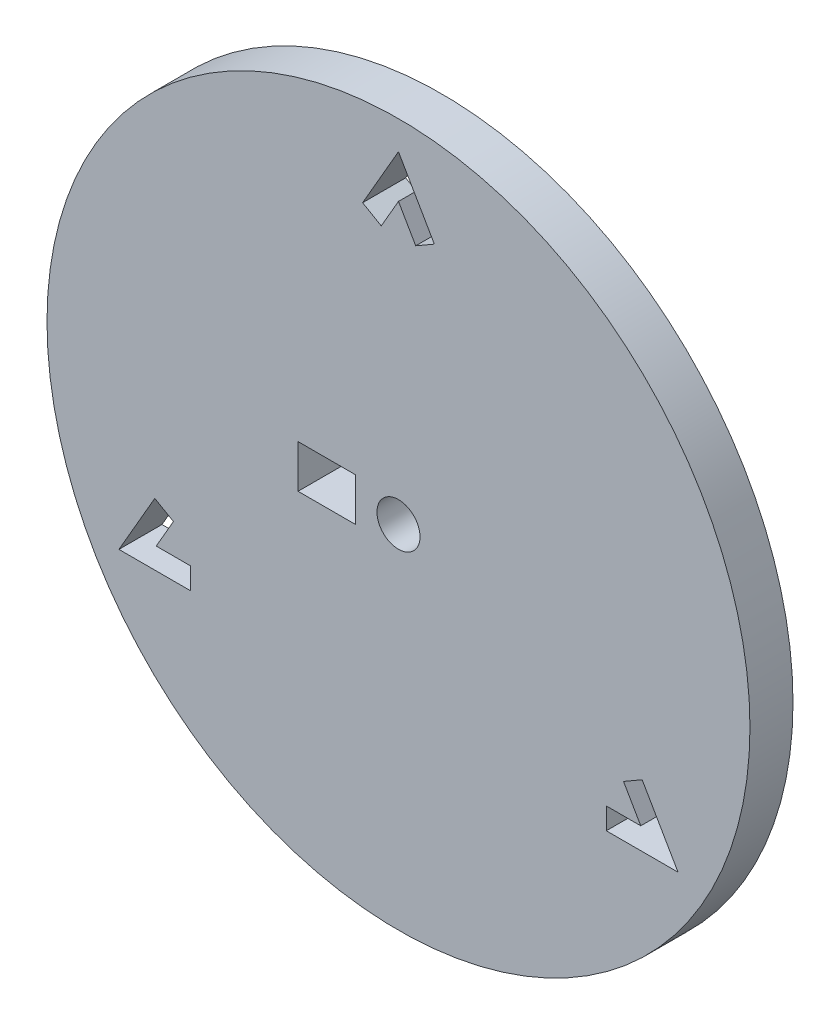
ISO-10303-21;
HEADER;
FILE_DESCRIPTION(('STEP AP214'),'2;1');
FILE_NAME('part.step','',(''),(''),'','','');
FILE_SCHEMA(('AUTOMOTIVE_DESIGN { 1 0 10303 214 1 1 1 1 }'));
ENDSEC;
DATA;
#1=APPLICATION_CONTEXT('core data for automotive mechanical design processes');
#2=APPLICATION_PROTOCOL_DEFINITION('international standard','automotive_design',2000,#1);
#3=PRODUCT_CONTEXT('',#1,'mechanical');
#4=PRODUCT('Part','Part','',(#3));
#5=PRODUCT_RELATED_PRODUCT_CATEGORY('part','',(#4));
#6=PRODUCT_DEFINITION_FORMATION('','',#4);
#7=PRODUCT_DEFINITION_CONTEXT('part definition',#1,'design');
#8=PRODUCT_DEFINITION('design','',#6,#7);
#9=PRODUCT_DEFINITION_SHAPE('','',#8);
#10=(LENGTH_UNIT() NAMED_UNIT(*) SI_UNIT(.MILLI.,.METRE.));
#11=(NAMED_UNIT(*) PLANE_ANGLE_UNIT() SI_UNIT($,.RADIAN.));
#12=(NAMED_UNIT(*) SI_UNIT($,.STERADIAN.) SOLID_ANGLE_UNIT());
#13=UNCERTAINTY_MEASURE_WITH_UNIT(LENGTH_MEASURE(1.E-05),#10,'distance_accuracy_value','');
#14=(GEOMETRIC_REPRESENTATION_CONTEXT(3) GLOBAL_UNCERTAINTY_ASSIGNED_CONTEXT((#13)) GLOBAL_UNIT_ASSIGNED_CONTEXT((#10,
#11,#12)) REPRESENTATION_CONTEXT('',''));
#15=CARTESIAN_POINT('',(0.,0.,0.));
#16=DIRECTION('',(0.,0.,1.));
#17=DIRECTION('',(1.,0.,0.));
#18=AXIS2_PLACEMENT_3D('',#15,#16,#17);
#19=CARTESIAN_POINT('',(-28.9711431702998,0.,6.));
#20=DIRECTION('',(-1.,0.,0.));
#21=DIRECTION('',(0.,0.,1.));
#22=AXIS2_PLACEMENT_3D('',#19,#20,#21);
#23=PLANE('',#22);
#24=DIRECTION('',(0.,1.,0.));
#25=VECTOR('',#24,1.);
#26=CARTESIAN_POINT('',(-28.9711431702998,0.,0.));
#27=LINE('',#26,#25);
#28=CARTESIAN_POINT('',(-28.9711431702998,-22.5,0.));
#29=VERTEX_POINT('',#28);
#30=CARTESIAN_POINT('',(-28.9711431702998,-19.5,0.));
#31=VERTEX_POINT('',#30);
#32=EDGE_CURVE('E300',#29,#31,#27,.T.);
#33=ORIENTED_EDGE('',*,*,#32,.F.);
#34=DIRECTION('',(0.,0.,-1.));
#35=VECTOR('',#34,1.);
#36=CARTESIAN_POINT('',(-28.9711431702998,-22.5,6.));
#37=LINE('',#36,#35);
#38=CARTESIAN_POINT('',(-28.9711431702998,-22.5,6.));
#39=VERTEX_POINT('',#38);
#40=EDGE_CURVE('E326',#39,#29,#37,.T.);
#41=ORIENTED_EDGE('',*,*,#40,.F.);
#42=DIRECTION('',(0.,1.,0.));
#43=VECTOR('',#42,1.);
#44=CARTESIAN_POINT('',(-28.9711431702998,0.,6.));
#45=LINE('',#44,#43);
#46=CARTESIAN_POINT('',(-28.9711431702998,-19.5,6.));
#47=VERTEX_POINT('',#46);
#48=EDGE_CURVE('E250',#39,#47,#45,.T.);
#49=ORIENTED_EDGE('',*,*,#48,.T.);
#50=DIRECTION('',(0.,0.,-1.));
#51=VECTOR('',#50,1.);
#52=CARTESIAN_POINT('',(-28.9711431702998,-19.5,6.));
#53=LINE('',#52,#51);
#54=EDGE_CURVE('E314',#47,#31,#53,.T.);
#55=ORIENTED_EDGE('',*,*,#54,.T.);
#56=EDGE_LOOP('',(#33,#41,#49,#55));
#57=FACE_BOUND('',#56,.T.);
#58=ADVANCED_FACE('F35',(#57),#23,.T.);
#59=CARTESIAN_POINT('',(0.,-22.5,6.));
#60=DIRECTION('',(0.,1.,0.));
#61=DIRECTION('',(-1.,0.,0.));
#62=AXIS2_PLACEMENT_3D('',#59,#60,#61);
#63=PLANE('',#62);
#64=DIRECTION('',(1.,0.,0.));
#65=VECTOR('',#64,1.);
#66=CARTESIAN_POINT('',(0.,-22.5,0.));
#67=LINE('',#66,#65);
#68=CARTESIAN_POINT('',(-38.9711431702998,-22.5,0.));
#69=VERTEX_POINT('',#68);
#70=EDGE_CURVE('E288',#69,#29,#67,.T.);
#71=ORIENTED_EDGE('',*,*,#70,.F.);
#72=DIRECTION('',(0.,0.,-1.));
#73=VECTOR('',#72,1.);
#74=CARTESIAN_POINT('',(-38.9711431702998,-22.5,6.));
#75=LINE('',#74,#73);
#76=CARTESIAN_POINT('',(-38.9711431702998,-22.5,6.));
#77=VERTEX_POINT('',#76);
#78=EDGE_CURVE('E324',#77,#69,#75,.T.);
#79=ORIENTED_EDGE('',*,*,#78,.F.);
#80=DIRECTION('',(1.,0.,0.));
#81=VECTOR('',#80,1.);
#82=CARTESIAN_POINT('',(0.,-22.5,6.));
#83=LINE('',#82,#81);
#84=EDGE_CURVE('E239',#77,#39,#83,.T.);
#85=ORIENTED_EDGE('',*,*,#84,.T.);
#86=ORIENTED_EDGE('',*,*,#40,.T.);
#87=EDGE_LOOP('',(#71,#79,#85,#86));
#88=FACE_BOUND('',#87,.T.);
#89=ADVANCED_FACE('F376',(#88),#63,.T.);
#90=CARTESIAN_POINT('',(-19.4855715851499,11.25,6.));
#91=DIRECTION('',(0.866025403784439,-0.5,0.));
#92=DIRECTION('',(0.5,0.866025403784439,0.));
#93=AXIS2_PLACEMENT_3D('',#90,#91,#92);
#94=PLANE('',#93);
#95=DIRECTION('',(-0.5,-0.866025403784439,0.));
#96=VECTOR('',#95,1.);
#97=CARTESIAN_POINT('',(-19.4855715851499,11.25,0.));
#98=LINE('',#97,#96);
#99=CARTESIAN_POINT('',(-33.9711431702998,-13.8397459621556,0.));
#100=VERTEX_POINT('',#99);
#101=EDGE_CURVE('E284',#100,#69,#98,.T.);
#102=ORIENTED_EDGE('',*,*,#101,.F.);
#103=DIRECTION('',(0.,0.,-1.));
#104=VECTOR('',#103,1.);
#105=CARTESIAN_POINT('',(-33.9711431702998,-13.8397459621556,6.));
#106=LINE('',#105,#104);
#107=CARTESIAN_POINT('',(-33.9711431702998,-13.8397459621556,6.));
#108=VERTEX_POINT('',#107);
#109=EDGE_CURVE('E322',#108,#100,#106,.T.);
#110=ORIENTED_EDGE('',*,*,#109,.F.);
#111=DIRECTION('',(-0.5,-0.866025403784439,0.));
#112=VECTOR('',#111,1.);
#113=CARTESIAN_POINT('',(-19.4855715851499,11.25,6.));
#114=LINE('',#113,#112);
#115=EDGE_CURVE('E235',#108,#77,#114,.T.);
#116=ORIENTED_EDGE('',*,*,#115,.T.);
#117=ORIENTED_EDGE('',*,*,#78,.T.);
#118=EDGE_LOOP('',(#102,#110,#116,#117));
#119=FACE_BOUND('',#118,.T.);
#120=ADVANCED_FACE('F382',(#119),#94,.T.);
#121=CARTESIAN_POINT('',(-14.4855715851499,-25.0897459621556,6.));
#122=DIRECTION('',(0.500000000000001,0.866025403784438,0.));
#123=DIRECTION('',(-0.866025403784438,0.500000000000001,0.));
#124=AXIS2_PLACEMENT_3D('',#121,#122,#123);
#125=PLANE('',#124);
#126=DIRECTION('',(0.866025403784438,-0.500000000000001,0.));
#127=VECTOR('',#126,1.);
#128=CARTESIAN_POINT('',(-14.4855715851499,-25.0897459621556,0.));
#129=LINE('',#128,#127);
#130=CARTESIAN_POINT('',(-31.3730669589464,-15.3397459621556,0.));
#131=VERTEX_POINT('',#130);
#132=EDGE_CURVE('E303',#100,#131,#129,.T.);
#133=ORIENTED_EDGE('',*,*,#132,.T.);
#134=DIRECTION('',(0.,0.,-1.));
#135=VECTOR('',#134,1.);
#136=CARTESIAN_POINT('',(-31.3730669589464,-15.3397459621556,6.));
#137=LINE('',#136,#135);
#138=CARTESIAN_POINT('',(-31.3730669589464,-15.3397459621556,6.));
#139=VERTEX_POINT('',#138);
#140=EDGE_CURVE('E319',#139,#131,#137,.T.);
#141=ORIENTED_EDGE('',*,*,#140,.F.);
#142=DIRECTION('',(0.866025403784438,-0.500000000000001,0.));
#143=VECTOR('',#142,1.);
#144=CARTESIAN_POINT('',(-14.4855715851499,-25.0897459621556,6.));
#145=LINE('',#144,#143);
#146=EDGE_CURVE('E253',#108,#139,#145,.T.);
#147=ORIENTED_EDGE('',*,*,#146,.F.);
#148=ORIENTED_EDGE('',*,*,#109,.T.);
#149=EDGE_LOOP('',(#133,#141,#147,#148));
#150=FACE_BOUND('',#149,.T.);
#151=ADVANCED_FACE('F568',(#150),#125,.F.);
#152=CARTESIAN_POINT('',(-16.8874953737965,9.75,6.));
#153=DIRECTION('',(0.866025403784439,-0.5,0.));
#154=DIRECTION('',(0.5,0.866025403784439,0.));
#155=AXIS2_PLACEMENT_3D('',#152,#153,#154);
#156=PLANE('',#155);
#157=DIRECTION('',(-0.5,-0.866025403784439,0.));
#158=VECTOR('',#157,1.);
#159=CARTESIAN_POINT('',(-16.8874953737965,9.75,0.));
#160=LINE('',#159,#158);
#161=CARTESIAN_POINT('',(-33.7749907475931,-19.5,0.));
#162=VERTEX_POINT('',#161);
#163=EDGE_CURVE('E306',#131,#162,#160,.T.);
#164=ORIENTED_EDGE('',*,*,#163,.T.);
#165=DIRECTION('',(0.,0.,-1.));
#166=VECTOR('',#165,1.);
#167=CARTESIAN_POINT('',(-33.7749907475931,-19.5,6.));
#168=LINE('',#167,#166);
#169=CARTESIAN_POINT('',(-33.7749907475931,-19.5,6.));
#170=VERTEX_POINT('',#169);
#171=EDGE_CURVE('E316',#170,#162,#168,.T.);
#172=ORIENTED_EDGE('',*,*,#171,.F.);
#173=DIRECTION('',(-0.5,-0.866025403784439,0.));
#174=VECTOR('',#173,1.);
#175=CARTESIAN_POINT('',(-16.8874953737965,9.75,6.));
#176=LINE('',#175,#174);
#177=EDGE_CURVE('E256',#139,#170,#176,.T.);
#178=ORIENTED_EDGE('',*,*,#177,.F.);
#179=ORIENTED_EDGE('',*,*,#140,.T.);
#180=EDGE_LOOP('',(#164,#172,#178,#179));
#181=FACE_BOUND('',#180,.T.);
#182=ADVANCED_FACE('F565',(#181),#156,.F.);
#183=CARTESIAN_POINT('',(28.9711431702997,-22.5,0.));
#184=VERTEX_POINT('',#183);
#185=CARTESIAN_POINT('',(38.9711431702997,-22.5,0.));
#186=VERTEX_POINT('',#185);
#187=EDGE_CURVE('E283',#184,#186,#67,.T.);
#188=ORIENTED_EDGE('',*,*,#187,.F.);
#189=DIRECTION('',(0.,0.,-1.));
#190=VECTOR('',#189,1.);
#191=CARTESIAN_POINT('',(28.9711431702997,-22.5,6.));
#192=LINE('',#191,#190);
#193=CARTESIAN_POINT('',(28.9711431702997,-22.5,6.));
#194=VERTEX_POINT('',#193);
#195=EDGE_CURVE('E317',#194,#184,#192,.T.);
#196=ORIENTED_EDGE('',*,*,#195,.F.);
#197=CARTESIAN_POINT('',(38.9711431702997,-22.5,6.));
#198=VERTEX_POINT('',#197);
#199=EDGE_CURVE('E234',#194,#198,#83,.T.);
#200=ORIENTED_EDGE('',*,*,#199,.T.);
#201=DIRECTION('',(0.,0.,-1.));
#202=VECTOR('',#201,1.);
#203=CARTESIAN_POINT('',(38.9711431702997,-22.5,6.));
#204=LINE('',#203,#202);
#205=EDGE_CURVE('E329',#198,#186,#204,.T.);
#206=ORIENTED_EDGE('',*,*,#205,.T.);
#207=EDGE_LOOP('',(#188,#196,#200,#206));
#208=FACE_BOUND('',#207,.T.);
#209=ADVANCED_FACE('F385',(#208),#63,.T.);
#210=CARTESIAN_POINT('',(28.9711431702997,0.,6.));
#211=DIRECTION('',(-1.,0.,0.));
#212=DIRECTION('',(0.,0.,1.));
#213=AXIS2_PLACEMENT_3D('',#210,#211,#212);
#214=PLANE('',#213);
#215=DIRECTION('',(0.,1.,0.));
#216=VECTOR('',#215,1.);
#217=CARTESIAN_POINT('',(28.9711431702997,0.,0.));
#218=LINE('',#217,#216);
#219=CARTESIAN_POINT('',(28.9711431702997,-19.5,0.));
#220=VERTEX_POINT('',#219);
#221=EDGE_CURVE('E287',#184,#220,#218,.T.);
#222=ORIENTED_EDGE('',*,*,#221,.T.);
#223=DIRECTION('',(0.,0.,-1.));
#224=VECTOR('',#223,1.);
#225=CARTESIAN_POINT('',(28.9711431702997,-19.5,6.));
#226=LINE('',#225,#224);
#227=CARTESIAN_POINT('',(28.9711431702997,-19.5,6.));
#228=VERTEX_POINT('',#227);
#229=EDGE_CURVE('E338',#228,#220,#226,.T.);
#230=ORIENTED_EDGE('',*,*,#229,.F.);
#231=DIRECTION('',(0.,1.,0.));
#232=VECTOR('',#231,1.);
#233=CARTESIAN_POINT('',(28.9711431702997,0.,6.));
#234=LINE('',#233,#232);
#235=EDGE_CURVE('E238',#194,#228,#234,.T.);
#236=ORIENTED_EDGE('',*,*,#235,.F.);
#237=ORIENTED_EDGE('',*,*,#195,.T.);
#238=EDGE_LOOP('',(#222,#230,#236,#237));
#239=FACE_BOUND('',#238,.T.);
#240=ADVANCED_FACE('F407',(#239),#214,.F.);
#241=CARTESIAN_POINT('',(0.,-19.5,6.));
#242=DIRECTION('',(0.,1.,0.));
#243=DIRECTION('',(0.,0.,1.));
#244=AXIS2_PLACEMENT_3D('',#241,#242,#243);
#245=PLANE('',#244);
#246=DIRECTION('',(1.,0.,0.));
#247=VECTOR('',#246,1.);
#248=CARTESIAN_POINT('',(0.,-19.5,0.));
#249=LINE('',#248,#247);
#250=CARTESIAN_POINT('',(33.7749907475931,-19.5,0.));
#251=VERTEX_POINT('',#250);
#252=EDGE_CURVE('E291',#220,#251,#249,.T.);
#253=ORIENTED_EDGE('',*,*,#252,.T.);
#254=DIRECTION('',(0.,0.,-1.));
#255=VECTOR('',#254,1.);
#256=CARTESIAN_POINT('',(33.7749907475931,-19.5,6.));
#257=LINE('',#256,#255);
#258=CARTESIAN_POINT('',(33.7749907475931,-19.5,6.));
#259=VERTEX_POINT('',#258);
#260=EDGE_CURVE('E336',#259,#251,#257,.T.);
#261=ORIENTED_EDGE('',*,*,#260,.F.);
#262=DIRECTION('',(1.,0.,0.));
#263=VECTOR('',#262,1.);
#264=CARTESIAN_POINT('',(0.,-19.5,6.));
#265=LINE('',#264,#263);
#266=EDGE_CURVE('E242',#228,#259,#265,.T.);
#267=ORIENTED_EDGE('',*,*,#266,.F.);
#268=ORIENTED_EDGE('',*,*,#229,.T.);
#269=EDGE_LOOP('',(#253,#261,#267,#268));
#270=FACE_BOUND('',#269,.T.);
#271=ADVANCED_FACE('F403',(#270),#245,.F.);
#272=CARTESIAN_POINT('',(16.8874953737965,9.75,6.));
#273=DIRECTION('',(0.866025403784439,0.5,0.));
#274=DIRECTION('',(-0.5,0.866025403784439,0.));
#275=AXIS2_PLACEMENT_3D('',#272,#273,#274);
#276=PLANE('',#275);
#277=DIRECTION('',(0.5,-0.866025403784439,0.));
#278=VECTOR('',#277,1.);
#279=CARTESIAN_POINT('',(16.8874953737965,9.75,0.));
#280=LINE('',#279,#278);
#281=CARTESIAN_POINT('',(31.3730669589464,-15.3397459621556,0.));
#282=VERTEX_POINT('',#281);
#283=EDGE_CURVE('E294',#282,#251,#280,.T.);
#284=ORIENTED_EDGE('',*,*,#283,.F.);
#285=DIRECTION('',(0.,0.,-1.));
#286=VECTOR('',#285,1.);
#287=CARTESIAN_POINT('',(31.3730669589464,-15.3397459621556,6.));
#288=LINE('',#287,#286);
#289=CARTESIAN_POINT('',(31.3730669589464,-15.3397459621556,6.));
#290=VERTEX_POINT('',#289);
#291=EDGE_CURVE('E334',#290,#282,#288,.T.);
#292=ORIENTED_EDGE('',*,*,#291,.F.);
#293=DIRECTION('',(0.5,-0.866025403784439,0.));
#294=VECTOR('',#293,1.);
#295=CARTESIAN_POINT('',(16.8874953737965,9.75,6.));
#296=LINE('',#295,#294);
#297=EDGE_CURVE('E244',#290,#259,#296,.T.);
#298=ORIENTED_EDGE('',*,*,#297,.T.);
#299=ORIENTED_EDGE('',*,*,#260,.T.);
#300=EDGE_LOOP('',(#284,#292,#298,#299));
#301=FACE_BOUND('',#300,.T.);
#302=ADVANCED_FACE('F399',(#301),#276,.T.);
#303=CARTESIAN_POINT('',(14.4855715851499,-25.0897459621556,6.));
#304=DIRECTION('',(0.5,-0.866025403784438,0.));
#305=DIRECTION('',(0.866025403784439,0.5,0.));
#306=AXIS2_PLACEMENT_3D('',#303,#304,#305);
#307=PLANE('',#306);
#308=DIRECTION('',(-0.866025403784439,-0.5,0.));
#309=VECTOR('',#308,1.);
#310=CARTESIAN_POINT('',(14.4855715851499,-25.0897459621556,0.));
#311=LINE('',#310,#309);
#312=CARTESIAN_POINT('',(33.9711431702997,-13.8397459621556,0.));
#313=VERTEX_POINT('',#312);
#314=EDGE_CURVE('E297',#313,#282,#311,.T.);
#315=ORIENTED_EDGE('',*,*,#314,.F.);
#316=DIRECTION('',(0.,0.,-1.));
#317=VECTOR('',#316,1.);
#318=CARTESIAN_POINT('',(33.9711431702997,-13.8397459621556,6.));
#319=LINE('',#318,#317);
#320=CARTESIAN_POINT('',(33.9711431702997,-13.8397459621556,6.));
#321=VERTEX_POINT('',#320);
#322=EDGE_CURVE('E331',#321,#313,#319,.T.);
#323=ORIENTED_EDGE('',*,*,#322,.F.);
#324=DIRECTION('',(-0.866025403784439,-0.5,0.));
#325=VECTOR('',#324,1.);
#326=CARTESIAN_POINT('',(14.4855715851499,-25.0897459621556,6.));
#327=LINE('',#326,#325);
#328=EDGE_CURVE('E247',#321,#290,#327,.T.);
#329=ORIENTED_EDGE('',*,*,#328,.T.);
#330=ORIENTED_EDGE('',*,*,#291,.T.);
#331=EDGE_LOOP('',(#315,#323,#329,#330));
#332=FACE_BOUND('',#331,.T.);
#333=ADVANCED_FACE('F396',(#332),#307,.T.);
#334=CARTESIAN_POINT('',(19.4855715851499,11.25,6.));
#335=DIRECTION('',(-0.866025403784439,-0.5,0.));
#336=DIRECTION('',(0.5,-0.866025403784439,0.));
#337=AXIS2_PLACEMENT_3D('',#334,#335,#336);
#338=PLANE('',#337);
#339=DIRECTION('',(-0.5,0.866025403784439,0.));
#340=VECTOR('',#339,1.);
#341=CARTESIAN_POINT('',(19.4855715851499,11.25,0.));
#342=LINE('',#341,#340);
#343=CARTESIAN_POINT('',(4.99999999999997,36.3397459621557,0.));
#344=VERTEX_POINT('',#343);
#345=CARTESIAN_POINT('',(0.,45.,0.));
#346=VERTEX_POINT('',#345);
#347=EDGE_CURVE('E265',#344,#346,#342,.T.);
#348=ORIENTED_EDGE('',*,*,#347,.F.);
#349=DIRECTION('',(0.,0.,-1.));
#350=VECTOR('',#349,1.);
#351=CARTESIAN_POINT('',(4.99999999999997,36.3397459621557,6.));
#352=LINE('',#351,#350);
#353=CARTESIAN_POINT('',(4.99999999999997,36.3397459621557,6.));
#354=VERTEX_POINT('',#353);
#355=EDGE_CURVE('E332',#354,#344,#352,.T.);
#356=ORIENTED_EDGE('',*,*,#355,.F.);
#357=DIRECTION('',(-0.5,0.866025403784439,0.));
#358=VECTOR('',#357,1.);
#359=CARTESIAN_POINT('',(19.4855715851499,11.25,6.));
#360=LINE('',#359,#358);
#361=CARTESIAN_POINT('',(0.,45.,6.));
#362=VERTEX_POINT('',#361);
#363=EDGE_CURVE('E216',#354,#362,#360,.T.);
#364=ORIENTED_EDGE('',*,*,#363,.T.);
#365=DIRECTION('',(0.,0.,-1.));
#366=VECTOR('',#365,1.);
#367=CARTESIAN_POINT('',(0.,45.,6.));
#368=LINE('',#367,#366);
#369=EDGE_CURVE('E264',#362,#346,#368,.T.);
#370=ORIENTED_EDGE('',*,*,#369,.T.);
#371=EDGE_LOOP('',(#348,#356,#364,#370));
#372=FACE_BOUND('',#371,.T.);
#373=ADVANCED_FACE('F395',(#372),#338,.T.);
#374=CARTESIAN_POINT('',(-14.4855715851499,25.0897459621557,6.));
#375=DIRECTION('',(0.499999999999999,-0.866025403784439,0.));
#376=DIRECTION('',(0.866025403784439,0.499999999999999,0.));
#377=AXIS2_PLACEMENT_3D('',#374,#375,#376);
#378=PLANE('',#377);
#379=DIRECTION('',(-0.866025403784439,-0.499999999999999,0.));
#380=VECTOR('',#379,1.);
#381=CARTESIAN_POINT('',(-14.4855715851499,25.0897459621557,0.));
#382=LINE('',#381,#380);
#383=CARTESIAN_POINT('',(2.40192378864667,34.8397459621556,0.));
#384=VERTEX_POINT('',#383);
#385=EDGE_CURVE('E268',#344,#384,#382,.T.);
#386=ORIENTED_EDGE('',*,*,#385,.T.);
#387=DIRECTION('',(0.,0.,-1.));
#388=VECTOR('',#387,1.);
#389=CARTESIAN_POINT('',(2.40192378864667,34.8397459621556,6.));
#390=LINE('',#389,#388);
#391=CARTESIAN_POINT('',(2.40192378864667,34.8397459621556,6.));
#392=VERTEX_POINT('',#391);
#393=EDGE_CURVE('E349',#392,#384,#390,.T.);
#394=ORIENTED_EDGE('',*,*,#393,.F.);
#395=DIRECTION('',(-0.866025403784439,-0.499999999999999,0.));
#396=VECTOR('',#395,1.);
#397=CARTESIAN_POINT('',(-14.4855715851499,25.0897459621557,6.));
#398=LINE('',#397,#396);
#399=EDGE_CURVE('E219',#354,#392,#398,.T.);
#400=ORIENTED_EDGE('',*,*,#399,.F.);
#401=ORIENTED_EDGE('',*,*,#355,.T.);
#402=EDGE_LOOP('',(#386,#394,#400,#401));
#403=FACE_BOUND('',#402,.T.);
#404=ADVANCED_FACE('F37',(#403),#378,.F.);
#405=CARTESIAN_POINT('',(16.8874953737965,9.74999999999996,6.));
#406=DIRECTION('',(-0.866025403784439,-0.499999999999999,0.));
#407=DIRECTION('',(0.499999999999999,-0.866025403784439,0.));
#408=AXIS2_PLACEMENT_3D('',#405,#406,#407);
#409=PLANE('',#408);
#410=DIRECTION('',(-0.499999999999999,0.866025403784439,0.));
#411=VECTOR('',#410,1.);
#412=CARTESIAN_POINT('',(16.8874953737965,9.74999999999996,0.));
#413=LINE('',#412,#411);
#414=CARTESIAN_POINT('',(0.,39.,0.));
#415=VERTEX_POINT('',#414);
#416=EDGE_CURVE('E271',#384,#415,#413,.T.);
#417=ORIENTED_EDGE('',*,*,#416,.T.);
#418=DIRECTION('',(0.,0.,-1.));
#419=VECTOR('',#418,1.);
#420=CARTESIAN_POINT('',(0.,39.,6.));
#421=LINE('',#420,#419);
#422=CARTESIAN_POINT('',(0.,39.,6.));
#423=VERTEX_POINT('',#422);
#424=EDGE_CURVE('E347',#423,#415,#421,.T.);
#425=ORIENTED_EDGE('',*,*,#424,.F.);
#426=DIRECTION('',(-0.499999999999999,0.866025403784439,0.));
#427=VECTOR('',#426,1.);
#428=CARTESIAN_POINT('',(16.8874953737965,9.74999999999996,6.));
#429=LINE('',#428,#427);
#430=EDGE_CURVE('E223',#392,#423,#429,.T.);
#431=ORIENTED_EDGE('',*,*,#430,.F.);
#432=ORIENTED_EDGE('',*,*,#393,.T.);
#433=EDGE_LOOP('',(#417,#425,#431,#432));
#434=FACE_BOUND('',#433,.T.);
#435=ADVANCED_FACE('F418',(#434),#409,.F.);
#436=CARTESIAN_POINT('',(-16.8874953737966,9.75000000000004,6.));
#437=DIRECTION('',(-0.866025403784438,0.500000000000001,0.));
#438=DIRECTION('',(-0.500000000000001,-0.866025403784438,0.));
#439=AXIS2_PLACEMENT_3D('',#436,#437,#438);
#440=PLANE('',#439);
#441=DIRECTION('',(0.500000000000001,0.866025403784438,0.));
#442=VECTOR('',#441,1.);
#443=CARTESIAN_POINT('',(-16.8874953737966,9.75000000000004,0.));
#444=LINE('',#443,#442);
#445=CARTESIAN_POINT('',(-2.40192378864669,34.8397459621556,0.));
#446=VERTEX_POINT('',#445);
#447=EDGE_CURVE('E274',#446,#415,#444,.T.);
#448=ORIENTED_EDGE('',*,*,#447,.F.);
#449=DIRECTION('',(0.,0.,-1.));
#450=VECTOR('',#449,1.);
#451=CARTESIAN_POINT('',(-2.40192378864669,34.8397459621556,6.));
#452=LINE('',#451,#450);
#453=CARTESIAN_POINT('',(-2.40192378864669,34.8397459621556,6.));
#454=VERTEX_POINT('',#453);
#455=EDGE_CURVE('E345',#454,#446,#452,.T.);
#456=ORIENTED_EDGE('',*,*,#455,.F.);
#457=DIRECTION('',(0.500000000000001,0.866025403784438,0.));
#458=VECTOR('',#457,1.);
#459=CARTESIAN_POINT('',(-16.8874953737966,9.75000000000004,6.));
#460=LINE('',#459,#458);
#461=EDGE_CURVE('E225',#454,#423,#460,.T.);
#462=ORIENTED_EDGE('',*,*,#461,.T.);
#463=ORIENTED_EDGE('',*,*,#424,.T.);
#464=EDGE_LOOP('',(#448,#456,#462,#463));
#465=FACE_BOUND('',#464,.T.);
#466=ADVANCED_FACE('F415',(#465),#440,.T.);
#467=CARTESIAN_POINT('',(14.4855715851499,25.0897459621556,6.));
#468=DIRECTION('',(0.5,0.866025403784439,0.));
#469=DIRECTION('',(-0.866025403784439,0.5,0.));
#470=AXIS2_PLACEMENT_3D('',#467,#468,#469);
#471=PLANE('',#470);
#472=DIRECTION('',(0.866025403784439,-0.5,0.));
#473=VECTOR('',#472,1.);
#474=CARTESIAN_POINT('',(14.4855715851499,25.0897459621556,0.));
#475=LINE('',#474,#473);
#476=CARTESIAN_POINT('',(-5.,36.3397459621556,0.));
#477=VERTEX_POINT('',#476);
#478=EDGE_CURVE('E277',#477,#446,#475,.T.);
#479=ORIENTED_EDGE('',*,*,#478,.F.);
#480=DIRECTION('',(0.,0.,-1.));
#481=VECTOR('',#480,1.);
#482=CARTESIAN_POINT('',(-5.,36.3397459621556,6.));
#483=LINE('',#482,#481);
#484=CARTESIAN_POINT('',(-5.,36.3397459621556,6.));
#485=VERTEX_POINT('',#484);
#486=EDGE_CURVE('E343',#485,#477,#483,.T.);
#487=ORIENTED_EDGE('',*,*,#486,.F.);
#488=DIRECTION('',(0.866025403784439,-0.5,0.));
#489=VECTOR('',#488,1.);
#490=CARTESIAN_POINT('',(14.4855715851499,25.0897459621556,6.));
#491=LINE('',#490,#489);
#492=EDGE_CURVE('E228',#485,#454,#491,.T.);
#493=ORIENTED_EDGE('',*,*,#492,.T.);
#494=ORIENTED_EDGE('',*,*,#455,.T.);
#495=EDGE_LOOP('',(#479,#487,#493,#494));
#496=FACE_BOUND('',#495,.T.);
#497=ADVANCED_FACE('F412',(#496),#471,.T.);
#498=CARTESIAN_POINT('',(0.,-19.5,6.));
#499=DIRECTION('',(0.,-1.,0.));
#500=DIRECTION('',(0.,0.,-1.));
#501=AXIS2_PLACEMENT_3D('',#498,#499,#500);
#502=PLANE('',#501);
#503=DIRECTION('',(-1.,0.,0.));
#504=VECTOR('',#503,1.);
#505=CARTESIAN_POINT('',(0.,-19.5,0.));
#506=LINE('',#505,#504);
#507=EDGE_CURVE('E309',#31,#162,#506,.T.);
#508=ORIENTED_EDGE('',*,*,#507,.F.);
#509=ORIENTED_EDGE('',*,*,#54,.F.);
#510=DIRECTION('',(-1.,0.,0.));
#511=VECTOR('',#510,1.);
#512=CARTESIAN_POINT('',(0.,-19.5,6.));
#513=LINE('',#512,#511);
#514=EDGE_CURVE('E258',#47,#170,#513,.T.);
#515=ORIENTED_EDGE('',*,*,#514,.T.);
#516=ORIENTED_EDGE('',*,*,#171,.T.);
#517=EDGE_LOOP('',(#508,#509,#515,#516));
#518=FACE_BOUND('',#517,.T.);
#519=ADVANCED_FACE('F393',(#518),#502,.T.);
#520=EDGE_CURVE('E269',#186,#313,#342,.T.);
#521=ORIENTED_EDGE('',*,*,#520,.F.);
#522=ORIENTED_EDGE('',*,*,#205,.F.);
#523=EDGE_CURVE('E221',#198,#321,#360,.T.);
#524=ORIENTED_EDGE('',*,*,#523,.T.);
#525=ORIENTED_EDGE('',*,*,#322,.T.);
#526=EDGE_LOOP('',(#521,#522,#524,#525));
#527=FACE_BOUND('',#526,.T.);
#528=ADVANCED_FACE('F389',(#527),#338,.T.);
#529=EDGE_CURVE('E280',#346,#477,#98,.T.);
#530=ORIENTED_EDGE('',*,*,#529,.F.);
#531=ORIENTED_EDGE('',*,*,#369,.F.);
#532=EDGE_CURVE('E231',#362,#485,#114,.T.);
#533=ORIENTED_EDGE('',*,*,#532,.T.);
#534=ORIENTED_EDGE('',*,*,#486,.T.);
#535=EDGE_LOOP('',(#530,#531,#533,#534));
#536=FACE_BOUND('',#535,.T.);
#537=ADVANCED_FACE('F392',(#536),#94,.T.);
#538=CARTESIAN_POINT('',(0.,0.,6.));
#539=DIRECTION('',(0.,0.,-1.));
#540=DIRECTION('',(-1.,0.,0.));
#541=AXIS2_PLACEMENT_3D('',#538,#539,#540);
#542=CYLINDRICAL_SURFACE('',#541,49.);
#543=CARTESIAN_POINT('',(0.,0.,6.));
#544=DIRECTION('',(0.,0.,1.));
#545=DIRECTION('',(1.,0.,0.));
#546=AXIS2_PLACEMENT_3D('',#543,#544,#545);
#547=CIRCLE('',#546,49.);
#548=CARTESIAN_POINT('',(49.,0.,6.));
#549=VERTEX_POINT('',#548);
#550=EDGE_CURVE('E261',#549,#549,#547,.T.);
#551=ORIENTED_EDGE('',*,*,#550,.F.);
#552=EDGE_LOOP('',(#551));
#553=FACE_BOUND('',#552,.T.);
#554=CARTESIAN_POINT('',(0.,0.,0.));
#555=DIRECTION('',(0.,0.,1.));
#556=DIRECTION('',(1.,0.,0.));
#557=AXIS2_PLACEMENT_3D('',#554,#555,#556);
#558=CIRCLE('',#557,49.);
#559=CARTESIAN_POINT('',(49.,0.,0.));
#560=VERTEX_POINT('',#559);
#561=EDGE_CURVE('E220',#560,#560,#558,.T.);
#562=ORIENTED_EDGE('',*,*,#561,.T.);
#563=EDGE_LOOP('',(#562));
#564=FACE_BOUND('',#563,.T.);
#565=ADVANCED_FACE('F498',(#553,#564),#542,.T.);
#566=CARTESIAN_POINT('',(0.,0.,6.));
#567=DIRECTION('',(0.,0.,1.));
#568=DIRECTION('',(1.,0.,0.));
#569=AXIS2_PLACEMENT_3D('',#566,#567,#568);
#570=PLANE('',#569);
#571=DIRECTION('',(1.,0.,0.));
#572=VECTOR('',#571,1.);
#573=CARTESIAN_POINT('',(0.,-3.,6.));
#574=LINE('',#573,#572);
#575=CARTESIAN_POINT('',(-14.,-3.,6.));
#576=VERTEX_POINT('',#575);
#577=CARTESIAN_POINT('',(-6.,-3.,6.));
#578=VERTEX_POINT('',#577);
#579=EDGE_CURVE('E50',#576,#578,#574,.T.);
#580=ORIENTED_EDGE('',*,*,#579,.F.);
#581=DIRECTION('',(0.,-1.,0.));
#582=VECTOR('',#581,1.);
#583=CARTESIAN_POINT('',(-14.,0.,6.));
#584=LINE('',#583,#582);
#585=CARTESIAN_POINT('',(-14.,3.,6.));
#586=VERTEX_POINT('',#585);
#587=EDGE_CURVE('E203',#586,#576,#584,.T.);
#588=ORIENTED_EDGE('',*,*,#587,.F.);
#589=DIRECTION('',(1.,0.,0.));
#590=VECTOR('',#589,1.);
#591=CARTESIAN_POINT('',(0.,3.,6.));
#592=LINE('',#591,#590);
#593=CARTESIAN_POINT('',(-6.,3.,6.));
#594=VERTEX_POINT('',#593);
#595=EDGE_CURVE('E187',#586,#594,#592,.T.);
#596=ORIENTED_EDGE('',*,*,#595,.T.);
#597=DIRECTION('',(0.,-1.,0.));
#598=VECTOR('',#597,1.);
#599=CARTESIAN_POINT('',(-6.,0.,6.));
#600=LINE('',#599,#598);
#601=EDGE_CURVE('E196',#594,#578,#600,.T.);
#602=ORIENTED_EDGE('',*,*,#601,.T.);
#603=EDGE_LOOP('',(#580,#588,#596,#602));
#604=FACE_BOUND('',#603,.T.);
#605=CARTESIAN_POINT('',(0.,0.,6.));
#606=DIRECTION('',(0.,0.,1.));
#607=DIRECTION('',(1.,0.,0.));
#608=AXIS2_PLACEMENT_3D('',#605,#606,#607);
#609=CIRCLE('',#608,3.);
#610=CARTESIAN_POINT('',(3.,0.,6.));
#611=VERTEX_POINT('',#610);
#612=EDGE_CURVE('E213',#611,#611,#609,.T.);
#613=ORIENTED_EDGE('',*,*,#612,.F.);
#614=EDGE_LOOP('',(#613));
#615=FACE_BOUND('',#614,.T.);
#616=ORIENTED_EDGE('',*,*,#363,.F.);
#617=ORIENTED_EDGE('',*,*,#399,.T.);
#618=ORIENTED_EDGE('',*,*,#430,.T.);
#619=ORIENTED_EDGE('',*,*,#461,.F.);
#620=ORIENTED_EDGE('',*,*,#492,.F.);
#621=ORIENTED_EDGE('',*,*,#532,.F.);
#622=EDGE_LOOP('',(#616,#617,#618,#619,#620,#621));
#623=FACE_BOUND('',#622,.T.);
#624=ORIENTED_EDGE('',*,*,#199,.F.);
#625=ORIENTED_EDGE('',*,*,#235,.T.);
#626=ORIENTED_EDGE('',*,*,#266,.T.);
#627=ORIENTED_EDGE('',*,*,#297,.F.);
#628=ORIENTED_EDGE('',*,*,#328,.F.);
#629=ORIENTED_EDGE('',*,*,#523,.F.);
#630=EDGE_LOOP('',(#624,#625,#626,#627,#628,#629));
#631=FACE_BOUND('',#630,.T.);
#632=ORIENTED_EDGE('',*,*,#48,.F.);
#633=ORIENTED_EDGE('',*,*,#84,.F.);
#634=ORIENTED_EDGE('',*,*,#115,.F.);
#635=ORIENTED_EDGE('',*,*,#146,.T.);
#636=ORIENTED_EDGE('',*,*,#177,.T.);
#637=ORIENTED_EDGE('',*,*,#514,.F.);
#638=EDGE_LOOP('',(#632,#633,#634,#635,#636,#637));
#639=FACE_BOUND('',#638,.T.);
#640=ORIENTED_EDGE('',*,*,#550,.T.);
#641=EDGE_LOOP('',(#640));
#642=FACE_BOUND('',#641,.T.);
#643=ADVANCED_FACE('F200',(#604,#615,#623,#631,#639,#642),#570,.T.);
#644=CARTESIAN_POINT('',(0.,0.,0.));
#645=DIRECTION('',(0.,0.,1.));
#646=DIRECTION('',(1.,0.,0.));
#647=AXIS2_PLACEMENT_3D('',#644,#645,#646);
#648=PLANE('',#647);
#649=DIRECTION('',(0.,-1.,0.));
#650=VECTOR('',#649,1.);
#651=CARTESIAN_POINT('',(-14.,0.,0.));
#652=LINE('',#651,#650);
#653=CARTESIAN_POINT('',(-14.,3.,0.));
#654=VERTEX_POINT('',#653);
#655=CARTESIAN_POINT('',(-14.,-3.,0.));
#656=VERTEX_POINT('',#655);
#657=EDGE_CURVE('E43',#654,#656,#652,.T.);
#658=ORIENTED_EDGE('',*,*,#657,.T.);
#659=DIRECTION('',(1.,0.,0.));
#660=VECTOR('',#659,1.);
#661=CARTESIAN_POINT('',(0.,-3.,0.));
#662=LINE('',#661,#660);
#663=CARTESIAN_POINT('',(-6.,-3.,0.));
#664=VERTEX_POINT('',#663);
#665=EDGE_CURVE('E11',#656,#664,#662,.T.);
#666=ORIENTED_EDGE('',*,*,#665,.T.);
#667=DIRECTION('',(0.,-1.,0.));
#668=VECTOR('',#667,1.);
#669=CARTESIAN_POINT('',(-6.,0.,0.));
#670=LINE('',#669,#668);
#671=CARTESIAN_POINT('',(-6.,3.,0.));
#672=VERTEX_POINT('',#671);
#673=EDGE_CURVE('E328',#672,#664,#670,.T.);
#674=ORIENTED_EDGE('',*,*,#673,.F.);
#675=DIRECTION('',(1.,0.,0.));
#676=VECTOR('',#675,1.);
#677=CARTESIAN_POINT('',(0.,3.,0.));
#678=LINE('',#677,#676);
#679=EDGE_CURVE('E190',#654,#672,#678,.T.);
#680=ORIENTED_EDGE('',*,*,#679,.F.);
#681=EDGE_LOOP('',(#658,#666,#674,#680));
#682=FACE_BOUND('',#681,.T.);
#683=CARTESIAN_POINT('',(0.,0.,0.));
#684=DIRECTION('',(0.,0.,1.));
#685=DIRECTION('',(1.,0.,0.));
#686=AXIS2_PLACEMENT_3D('',#683,#684,#685);
#687=CIRCLE('',#686,3.);
#688=CARTESIAN_POINT('',(3.,0.,0.));
#689=VERTEX_POINT('',#688);
#690=EDGE_CURVE('E210',#689,#689,#687,.T.);
#691=ORIENTED_EDGE('',*,*,#690,.T.);
#692=EDGE_LOOP('',(#691));
#693=FACE_BOUND('',#692,.T.);
#694=ORIENTED_EDGE('',*,*,#347,.T.);
#695=ORIENTED_EDGE('',*,*,#529,.T.);
#696=ORIENTED_EDGE('',*,*,#478,.T.);
#697=ORIENTED_EDGE('',*,*,#447,.T.);
#698=ORIENTED_EDGE('',*,*,#416,.F.);
#699=ORIENTED_EDGE('',*,*,#385,.F.);
#700=EDGE_LOOP('',(#694,#695,#696,#697,#698,#699));
#701=FACE_BOUND('',#700,.T.);
#702=ORIENTED_EDGE('',*,*,#187,.T.);
#703=ORIENTED_EDGE('',*,*,#520,.T.);
#704=ORIENTED_EDGE('',*,*,#314,.T.);
#705=ORIENTED_EDGE('',*,*,#283,.T.);
#706=ORIENTED_EDGE('',*,*,#252,.F.);
#707=ORIENTED_EDGE('',*,*,#221,.F.);
#708=EDGE_LOOP('',(#702,#703,#704,#705,#706,#707));
#709=FACE_BOUND('',#708,.T.);
#710=ORIENTED_EDGE('',*,*,#32,.T.);
#711=ORIENTED_EDGE('',*,*,#507,.T.);
#712=ORIENTED_EDGE('',*,*,#163,.F.);
#713=ORIENTED_EDGE('',*,*,#132,.F.);
#714=ORIENTED_EDGE('',*,*,#101,.T.);
#715=ORIENTED_EDGE('',*,*,#70,.T.);
#716=EDGE_LOOP('',(#710,#711,#712,#713,#714,#715));
#717=FACE_BOUND('',#716,.T.);
#718=ORIENTED_EDGE('',*,*,#561,.F.);
#719=EDGE_LOOP('',(#718));
#720=FACE_BOUND('',#719,.T.);
#721=ADVANCED_FACE('F358',(#682,#693,#701,#709,#717,#720),#648,.F.);
#722=CARTESIAN_POINT('',(0.,0.,-4.));
#723=DIRECTION('',(0.,0.,1.));
#724=DIRECTION('',(1.,0.,0.));
#725=AXIS2_PLACEMENT_3D('',#722,#723,#724);
#726=CYLINDRICAL_SURFACE('',#725,3.);
#727=ORIENTED_EDGE('',*,*,#612,.T.);
#728=EDGE_LOOP('',(#727));
#729=FACE_BOUND('',#728,.T.);
#730=ORIENTED_EDGE('',*,*,#690,.F.);
#731=EDGE_LOOP('',(#730));
#732=FACE_BOUND('',#731,.T.);
#733=ADVANCED_FACE('F365',(#729,#732),#726,.F.);
#734=CARTESIAN_POINT('',(0.,-3.,-4.));
#735=DIRECTION('',(0.,-1.,0.));
#736=DIRECTION('',(0.,0.,-1.));
#737=AXIS2_PLACEMENT_3D('',#734,#735,#736);
#738=PLANE('',#737);
#739=DIRECTION('',(0.,0.,1.));
#740=VECTOR('',#739,1.);
#741=CARTESIAN_POINT('',(-14.,-3.,-4.));
#742=LINE('',#741,#740);
#743=EDGE_CURVE('E208',#656,#576,#742,.T.);
#744=ORIENTED_EDGE('',*,*,#743,.T.);
#745=ORIENTED_EDGE('',*,*,#579,.T.);
#746=DIRECTION('',(0.,0.,1.));
#747=VECTOR('',#746,1.);
#748=CARTESIAN_POINT('',(-6.,-3.,-4.));
#749=LINE('',#748,#747);
#750=EDGE_CURVE('E193',#664,#578,#749,.T.);
#751=ORIENTED_EDGE('',*,*,#750,.F.);
#752=ORIENTED_EDGE('',*,*,#665,.F.);
#753=EDGE_LOOP('',(#744,#745,#751,#752));
#754=FACE_BOUND('',#753,.T.);
#755=ADVANCED_FACE('F363',(#754),#738,.F.);
#756=CARTESIAN_POINT('',(-14.,0.,-4.));
#757=DIRECTION('',(-1.,0.,0.));
#758=DIRECTION('',(0.,0.,1.));
#759=AXIS2_PLACEMENT_3D('',#756,#757,#758);
#760=PLANE('',#759);
#761=DIRECTION('',(0.,0.,1.));
#762=VECTOR('',#761,1.);
#763=CARTESIAN_POINT('',(-14.,3.,-4.));
#764=LINE('',#763,#762);
#765=EDGE_CURVE('E192',#654,#586,#764,.T.);
#766=ORIENTED_EDGE('',*,*,#765,.T.);
#767=ORIENTED_EDGE('',*,*,#587,.T.);
#768=ORIENTED_EDGE('',*,*,#743,.F.);
#769=ORIENTED_EDGE('',*,*,#657,.F.);
#770=EDGE_LOOP('',(#766,#767,#768,#769));
#771=FACE_BOUND('',#770,.T.);
#772=ADVANCED_FACE('F362',(#771),#760,.F.);
#773=CARTESIAN_POINT('',(0.,3.,-4.));
#774=DIRECTION('',(0.,-1.,0.));
#775=DIRECTION('',(0.,0.,-1.));
#776=AXIS2_PLACEMENT_3D('',#773,#774,#775);
#777=PLANE('',#776);
#778=ORIENTED_EDGE('',*,*,#679,.T.);
#779=DIRECTION('',(0.,0.,1.));
#780=VECTOR('',#779,1.);
#781=CARTESIAN_POINT('',(-6.,3.,-4.));
#782=LINE('',#781,#780);
#783=EDGE_CURVE('E58',#672,#594,#782,.T.);
#784=ORIENTED_EDGE('',*,*,#783,.T.);
#785=ORIENTED_EDGE('',*,*,#595,.F.);
#786=ORIENTED_EDGE('',*,*,#765,.F.);
#787=EDGE_LOOP('',(#778,#784,#785,#786));
#788=FACE_BOUND('',#787,.T.);
#789=ADVANCED_FACE('F184',(#788),#777,.T.);
#790=CARTESIAN_POINT('',(-6.,0.,-4.));
#791=DIRECTION('',(-1.,0.,0.));
#792=DIRECTION('',(0.,0.,1.));
#793=AXIS2_PLACEMENT_3D('',#790,#791,#792);
#794=PLANE('',#793);
#795=ORIENTED_EDGE('',*,*,#673,.T.);
#796=ORIENTED_EDGE('',*,*,#750,.T.);
#797=ORIENTED_EDGE('',*,*,#601,.F.);
#798=ORIENTED_EDGE('',*,*,#783,.F.);
#799=EDGE_LOOP('',(#795,#796,#797,#798));
#800=FACE_BOUND('',#799,.T.);
#801=ADVANCED_FACE('F197',(#800),#794,.T.);
#802=CLOSED_SHELL('',(#58,#89,#120,#151,#182,#209,#240,#271,#302,#333,#373,#404,#435,#466,#497,
#519,#528,#537,#565,#643,#721,#733,#755,#772,#789,#801));
#803=MANIFOLD_SOLID_BREP('B2',#802);
#804=ADVANCED_BREP_SHAPE_REPRESENTATION('',(#18,#803),#14);
#805=SHAPE_DEFINITION_REPRESENTATION(#9,#804);
ENDSEC;
END-ISO-10303-21;
